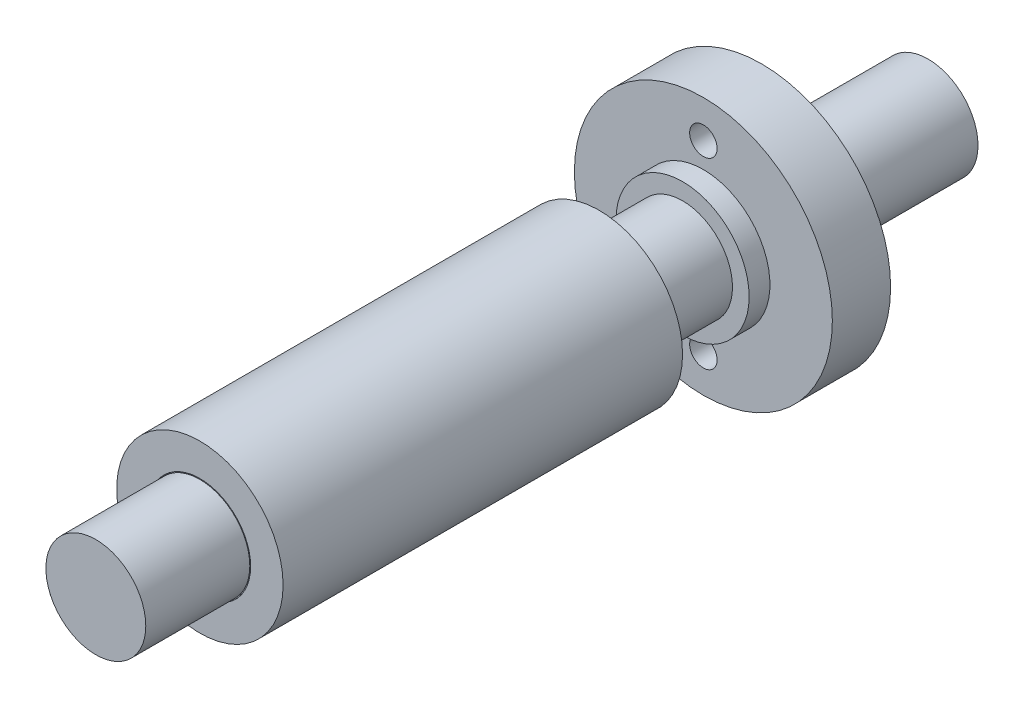
ISO-10303-21;
HEADER;
FILE_DESCRIPTION(('STEP AP214'),'2;1');
FILE_NAME('part.step','',(''),(''),'','','');
FILE_SCHEMA(('AUTOMOTIVE_DESIGN { 1 0 10303 214 1 1 1 1 }'));
ENDSEC;
DATA;
#1=APPLICATION_CONTEXT('core data for automotive mechanical design processes');
#2=APPLICATION_PROTOCOL_DEFINITION('international standard','automotive_design',2000,#1);
#3=PRODUCT_CONTEXT('',#1,'mechanical');
#4=PRODUCT('Part','Part','',(#3));
#5=PRODUCT_RELATED_PRODUCT_CATEGORY('part','',(#4));
#6=PRODUCT_DEFINITION_FORMATION('','',#4);
#7=PRODUCT_DEFINITION_CONTEXT('part definition',#1,'design');
#8=PRODUCT_DEFINITION('design','',#6,#7);
#9=PRODUCT_DEFINITION_SHAPE('','',#8);
#10=(LENGTH_UNIT() NAMED_UNIT(*) SI_UNIT(.MILLI.,.METRE.));
#11=(NAMED_UNIT(*) PLANE_ANGLE_UNIT() SI_UNIT($,.RADIAN.));
#12=(NAMED_UNIT(*) SI_UNIT($,.STERADIAN.) SOLID_ANGLE_UNIT());
#13=UNCERTAINTY_MEASURE_WITH_UNIT(LENGTH_MEASURE(1.E-05),#10,'distance_accuracy_value','');
#14=(GEOMETRIC_REPRESENTATION_CONTEXT(3) GLOBAL_UNCERTAINTY_ASSIGNED_CONTEXT((#13)) GLOBAL_UNIT_ASSIGNED_CONTEXT((#10,
#11,#12)) REPRESENTATION_CONTEXT('',''));
#15=CARTESIAN_POINT('',(0.,0.,0.));
#16=DIRECTION('',(0.,0.,1.));
#17=DIRECTION('',(1.,0.,0.));
#18=AXIS2_PLACEMENT_3D('',#15,#16,#17);
#19=CARTESIAN_POINT('',(0.,0.,22.2465945390482));
#20=DIRECTION('',(0.,0.,1.));
#21=DIRECTION('',(1.,0.,0.));
#22=AXIS2_PLACEMENT_3D('',#19,#20,#21);
#23=CYLINDRICAL_SURFACE('',#22,6.1);
#24=CARTESIAN_POINT('',(0.,0.,39.5));
#25=DIRECTION('',(0.,0.,1.));
#26=DIRECTION('',(1.,0.,0.));
#27=AXIS2_PLACEMENT_3D('',#24,#25,#26);
#28=CIRCLE('',#27,6.1);
#29=CARTESIAN_POINT('',(6.1,0.,39.5));
#30=VERTEX_POINT('',#29);
#31=EDGE_CURVE('E61',#30,#30,#28,.F.);
#32=ORIENTED_EDGE('',*,*,#31,.T.);
#33=EDGE_LOOP('',(#32));
#34=FACE_BOUND('',#33,.T.);
#35=CARTESIAN_POINT('',(0.,0.,87.5));
#36=DIRECTION('',(0.,0.,1.));
#37=DIRECTION('',(1.,0.,0.));
#38=AXIS2_PLACEMENT_3D('',#35,#36,#37);
#39=CIRCLE('',#38,6.1);
#40=CARTESIAN_POINT('',(6.1,0.,87.5));
#41=VERTEX_POINT('',#40);
#42=EDGE_CURVE('E70',#41,#41,#39,.T.);
#43=ORIENTED_EDGE('',*,*,#42,.T.);
#44=EDGE_LOOP('',(#43));
#45=FACE_BOUND('',#44,.T.);
#46=ADVANCED_FACE('F58',(#34,#45),#23,.F.);
#47=CARTESIAN_POINT('',(0.,0.,87.5));
#48=DIRECTION('',(0.,0.,1.));
#49=DIRECTION('',(1.,0.,0.));
#50=AXIS2_PLACEMENT_3D('',#47,#48,#49);
#51=PLANE('',#50);
#52=ORIENTED_EDGE('',*,*,#42,.F.);
#53=EDGE_LOOP('',(#52));
#54=FACE_BOUND('',#53,.T.);
#55=CARTESIAN_POINT('',(0.,0.,87.5));
#56=DIRECTION('',(0.,0.,1.));
#57=DIRECTION('',(1.,0.,0.));
#58=AXIS2_PLACEMENT_3D('',#55,#56,#57);
#59=CIRCLE('',#58,10.);
#60=CARTESIAN_POINT('',(10.,0.,87.5));
#61=VERTEX_POINT('',#60);
#62=EDGE_CURVE('E65',#61,#61,#59,.T.);
#63=ORIENTED_EDGE('',*,*,#62,.T.);
#64=EDGE_LOOP('',(#63));
#65=FACE_BOUND('',#64,.T.);
#66=ADVANCED_FACE('F87',(#54,#65),#51,.T.);
#67=CARTESIAN_POINT('',(0.,0.,87.5));
#68=DIRECTION('',(0.,0.,-1.));
#69=DIRECTION('',(-1.,0.,0.));
#70=AXIS2_PLACEMENT_3D('',#67,#68,#69);
#71=CYLINDRICAL_SURFACE('',#70,10.);
#72=ORIENTED_EDGE('',*,*,#62,.F.);
#73=EDGE_LOOP('',(#72));
#74=FACE_BOUND('',#73,.T.);
#75=CARTESIAN_POINT('',(0.,0.,39.5));
#76=DIRECTION('',(0.,0.,1.));
#77=DIRECTION('',(1.,0.,0.));
#78=AXIS2_PLACEMENT_3D('',#75,#76,#77);
#79=CIRCLE('',#78,10.);
#80=CARTESIAN_POINT('',(10.,0.,39.5));
#81=VERTEX_POINT('',#80);
#82=EDGE_CURVE('E11',#81,#81,#79,.T.);
#83=ORIENTED_EDGE('',*,*,#82,.T.);
#84=EDGE_LOOP('',(#83));
#85=FACE_BOUND('',#84,.T.);
#86=ADVANCED_FACE('F82',(#74,#85),#71,.T.);
#87=CARTESIAN_POINT('',(0.,0.,39.5));
#88=DIRECTION('',(0.,0.,1.));
#89=DIRECTION('',(1.,0.,0.));
#90=AXIS2_PLACEMENT_3D('',#87,#88,#89);
#91=PLANE('',#90);
#92=ORIENTED_EDGE('',*,*,#31,.F.);
#93=EDGE_LOOP('',(#92));
#94=FACE_BOUND('',#93,.T.);
#95=ORIENTED_EDGE('',*,*,#82,.F.);
#96=EDGE_LOOP('',(#95));
#97=FACE_BOUND('',#96,.T.);
#98=ADVANCED_FACE('F79',(#94,#97),#91,.F.);
#99=CLOSED_SHELL('',(#46,#66,#86,#98));
#100=MANIFOLD_SOLID_BREP('B2_NOT_SHOWN',#99);
#101=CARTESIAN_POINT('',(0.,0.,100.));
#102=DIRECTION('',(0.,0.,-1.));
#103=DIRECTION('',(-1.,0.,0.));
#104=AXIS2_PLACEMENT_3D('',#101,#102,#103);
#105=CYLINDRICAL_SURFACE('',#104,6.);
#106=CARTESIAN_POINT('',(0.,0.,40.5));
#107=DIRECTION('',(0.,0.,1.));
#108=DIRECTION('',(1.,0.,0.));
#109=AXIS2_PLACEMENT_3D('',#106,#107,#108);
#110=CIRCLE('',#109,6.);
#111=CARTESIAN_POINT('',(6.,0.,40.5));
#112=VERTEX_POINT('',#111);
#113=EDGE_CURVE('E183',#112,#112,#110,.T.);
#114=ORIENTED_EDGE('',*,*,#113,.T.);
#115=EDGE_LOOP('',(#114));
#116=FACE_BOUND('',#115,.T.);
#117=CARTESIAN_POINT('',(0.,0.,86.5));
#118=DIRECTION('',(0.,0.,1.));
#119=DIRECTION('',(1.,0.,0.));
#120=AXIS2_PLACEMENT_3D('',#117,#118,#119);
#121=CIRCLE('',#120,6.);
#122=CARTESIAN_POINT('',(6.,0.,86.5));
#123=VERTEX_POINT('',#122);
#124=EDGE_CURVE('E261',#123,#123,#121,.T.);
#125=ORIENTED_EDGE('',*,*,#124,.F.);
#126=EDGE_LOOP('',(#125));
#127=FACE_BOUND('',#126,.T.);
#128=ADVANCED_FACE('F141',(#116,#127),#105,.T.);
#129=CARTESIAN_POINT('',(0.,0.,29.5));
#130=DIRECTION('',(0.,0.,1.));
#131=DIRECTION('',(1.,0.,0.));
#132=AXIS2_PLACEMENT_3D('',#129,#130,#131);
#133=CIRCLE('',#132,6.);
#134=CARTESIAN_POINT('',(6.,0.,29.5));
#135=VERTEX_POINT('',#134);
#136=EDGE_CURVE('E162',#135,#135,#133,.T.);
#137=ORIENTED_EDGE('',*,*,#136,.T.);
#138=EDGE_LOOP('',(#137));
#139=FACE_BOUND('',#138,.T.);
#140=CARTESIAN_POINT('',(0.,0.,39.5));
#141=DIRECTION('',(0.,0.,1.));
#142=DIRECTION('',(1.,0.,0.));
#143=AXIS2_PLACEMENT_3D('',#140,#141,#142);
#144=CIRCLE('',#143,6.);
#145=CARTESIAN_POINT('',(6.,0.,39.5));
#146=VERTEX_POINT('',#145);
#147=EDGE_CURVE('E186',#146,#146,#144,.T.);
#148=ORIENTED_EDGE('',*,*,#147,.F.);
#149=EDGE_LOOP('',(#148));
#150=FACE_BOUND('',#149,.T.);
#151=ADVANCED_FACE('F218',(#139,#150),#105,.T.);
#152=CARTESIAN_POINT('',(0.,0.,27.));
#153=DIRECTION('',(0.,0.,-1.));
#154=DIRECTION('',(-1.,0.,0.));
#155=AXIS2_PLACEMENT_3D('',#152,#153,#154);
#156=CYLINDRICAL_SURFACE('',#155,15.5);
#157=CARTESIAN_POINT('',(0.,0.,27.));
#158=DIRECTION('',(0.,0.,-1.));
#159=DIRECTION('',(-1.,0.,0.));
#160=AXIS2_PLACEMENT_3D('',#157,#158,#159);
#161=CIRCLE('',#160,15.5);
#162=CARTESIAN_POINT('',(-15.5,0.,27.));
#163=VERTEX_POINT('',#162);
#164=EDGE_CURVE('E192',#163,#163,#161,.T.);
#165=ORIENTED_EDGE('',*,*,#164,.T.);
#166=EDGE_LOOP('',(#165));
#167=FACE_BOUND('',#166,.T.);
#168=CARTESIAN_POINT('',(0.,0.,20.));
#169=DIRECTION('',(0.,0.,-1.));
#170=DIRECTION('',(-1.,0.,0.));
#171=AXIS2_PLACEMENT_3D('',#168,#169,#170);
#172=CIRCLE('',#171,15.5);
#173=CARTESIAN_POINT('',(-15.5,0.,20.));
#174=VERTEX_POINT('',#173);
#175=EDGE_CURVE('E165',#174,#174,#172,.T.);
#176=ORIENTED_EDGE('',*,*,#175,.F.);
#177=EDGE_LOOP('',(#176));
#178=FACE_BOUND('',#177,.T.);
#179=ADVANCED_FACE('F216',(#167,#178),#156,.T.);
#180=CARTESIAN_POINT('',(0.,0.,27.));
#181=DIRECTION('',(0.,0.,-1.));
#182=DIRECTION('',(-1.,0.,0.));
#183=AXIS2_PLACEMENT_3D('',#180,#181,#182);
#184=PLANE('',#183);
#185=CARTESIAN_POINT('',(0.,11.,27.));
#186=DIRECTION('',(0.,0.,1.));
#187=DIRECTION('',(1.,0.,0.));
#188=AXIS2_PLACEMENT_3D('',#185,#186,#187);
#189=CIRCLE('',#188,1.65);
#190=CARTESIAN_POINT('',(1.65,11.,27.));
#191=VERTEX_POINT('',#190);
#192=EDGE_CURVE('E170',#191,#191,#189,.T.);
#193=ORIENTED_EDGE('',*,*,#192,.F.);
#194=EDGE_LOOP('',(#193));
#195=FACE_BOUND('',#194,.T.);
#196=CARTESIAN_POINT('',(0.,-11.,27.));
#197=DIRECTION('',(0.,0.,1.));
#198=DIRECTION('',(1.,0.,0.));
#199=AXIS2_PLACEMENT_3D('',#196,#197,#198);
#200=CIRCLE('',#199,1.65);
#201=CARTESIAN_POINT('',(1.65,-11.,27.));
#202=VERTEX_POINT('',#201);
#203=EDGE_CURVE('E177',#202,#202,#200,.T.);
#204=ORIENTED_EDGE('',*,*,#203,.F.);
#205=EDGE_LOOP('',(#204));
#206=FACE_BOUND('',#205,.T.);
#207=CARTESIAN_POINT('',(0.,0.,27.));
#208=DIRECTION('',(0.,0.,-1.));
#209=DIRECTION('',(-1.,0.,0.));
#210=AXIS2_PLACEMENT_3D('',#207,#208,#209);
#211=CIRCLE('',#210,8.);
#212=CARTESIAN_POINT('',(-8.,0.,27.));
#213=VERTEX_POINT('',#212);
#214=EDGE_CURVE('E57',#213,#213,#211,.F.);
#215=ORIENTED_EDGE('',*,*,#214,.F.);
#216=EDGE_LOOP('',(#215));
#217=FACE_BOUND('',#216,.T.);
#218=ORIENTED_EDGE('',*,*,#164,.F.);
#219=EDGE_LOOP('',(#218));
#220=FACE_BOUND('',#219,.T.);
#221=ADVANCED_FACE('F211',(#195,#206,#217,#220),#184,.F.);
#222=CARTESIAN_POINT('',(0.,0.,20.));
#223=DIRECTION('',(0.,0.,-1.));
#224=DIRECTION('',(-1.,0.,0.));
#225=AXIS2_PLACEMENT_3D('',#222,#223,#224);
#226=PLANE('',#225);
#227=CARTESIAN_POINT('',(0.,11.,20.));
#228=DIRECTION('',(0.,0.,-1.));
#229=DIRECTION('',(-1.,0.,0.));
#230=AXIS2_PLACEMENT_3D('',#227,#228,#229);
#231=CIRCLE('',#230,1.65);
#232=CARTESIAN_POINT('',(-1.65,11.,20.));
#233=VERTEX_POINT('',#232);
#234=EDGE_CURVE('E145',#233,#233,#231,.T.);
#235=ORIENTED_EDGE('',*,*,#234,.F.);
#236=EDGE_LOOP('',(#235));
#237=FACE_BOUND('',#236,.T.);
#238=CARTESIAN_POINT('',(0.,-11.,20.));
#239=DIRECTION('',(0.,0.,-1.));
#240=DIRECTION('',(-1.,0.,0.));
#241=AXIS2_PLACEMENT_3D('',#238,#239,#240);
#242=CIRCLE('',#241,1.65);
#243=CARTESIAN_POINT('',(-1.65,-11.,20.));
#244=VERTEX_POINT('',#243);
#245=EDGE_CURVE('E167',#244,#244,#242,.T.);
#246=ORIENTED_EDGE('',*,*,#245,.F.);
#247=EDGE_LOOP('',(#246));
#248=FACE_BOUND('',#247,.T.);
#249=CARTESIAN_POINT('',(0.,0.,20.));
#250=DIRECTION('',(0.,0.,-1.));
#251=DIRECTION('',(-1.,0.,0.));
#252=AXIS2_PLACEMENT_3D('',#249,#250,#251);
#253=CIRCLE('',#252,6.);
#254=CARTESIAN_POINT('',(-6.,0.,20.));
#255=VERTEX_POINT('',#254);
#256=EDGE_CURVE('E160',#255,#255,#253,.T.);
#257=ORIENTED_EDGE('',*,*,#256,.F.);
#258=EDGE_LOOP('',(#257));
#259=FACE_BOUND('',#258,.T.);
#260=ORIENTED_EDGE('',*,*,#175,.T.);
#261=EDGE_LOOP('',(#260));
#262=FACE_BOUND('',#261,.T.);
#263=ADVANCED_FACE('F207',(#237,#248,#259,#262),#226,.T.);
#264=CARTESIAN_POINT('',(0.,0.,0.));
#265=DIRECTION('',(0.,0.,1.));
#266=DIRECTION('',(1.,0.,0.));
#267=AXIS2_PLACEMENT_3D('',#264,#265,#266);
#268=PLANE('',#267);
#269=CARTESIAN_POINT('',(0.,0.,0.));
#270=DIRECTION('',(0.,0.,1.));
#271=DIRECTION('',(1.,0.,0.));
#272=AXIS2_PLACEMENT_3D('',#269,#270,#271);
#273=CIRCLE('',#272,6.);
#274=CARTESIAN_POINT('',(6.,0.,0.));
#275=VERTEX_POINT('',#274);
#276=EDGE_CURVE('E156',#275,#275,#273,.T.);
#277=ORIENTED_EDGE('',*,*,#276,.F.);
#278=EDGE_LOOP('',(#277));
#279=FACE_BOUND('',#278,.T.);
#280=ADVANCED_FACE('F210',(#279),#268,.F.);
#281=ORIENTED_EDGE('',*,*,#256,.T.);
#282=EDGE_LOOP('',(#281));
#283=FACE_BOUND('',#282,.T.);
#284=ORIENTED_EDGE('',*,*,#276,.T.);
#285=EDGE_LOOP('',(#284));
#286=FACE_BOUND('',#285,.T.);
#287=ADVANCED_FACE('F143',(#283,#286),#105,.T.);
#288=CARTESIAN_POINT('',(0.,0.,29.5));
#289=DIRECTION('',(0.,0.,-1.));
#290=DIRECTION('',(-1.,0.,0.));
#291=AXIS2_PLACEMENT_3D('',#288,#289,#290);
#292=CYLINDRICAL_SURFACE('',#291,8.);
#293=CARTESIAN_POINT('',(0.,0.,29.5));
#294=DIRECTION('',(0.,0.,1.));
#295=DIRECTION('',(1.,0.,0.));
#296=AXIS2_PLACEMENT_3D('',#293,#294,#295);
#297=CIRCLE('',#296,8.);
#298=CARTESIAN_POINT('',(8.,0.,29.5));
#299=VERTEX_POINT('',#298);
#300=EDGE_CURVE('E166',#299,#299,#297,.T.);
#301=ORIENTED_EDGE('',*,*,#300,.F.);
#302=EDGE_LOOP('',(#301));
#303=FACE_BOUND('',#302,.T.);
#304=ORIENTED_EDGE('',*,*,#214,.T.);
#305=EDGE_LOOP('',(#304));
#306=FACE_BOUND('',#305,.T.);
#307=ADVANCED_FACE('F237',(#303,#306),#292,.T.);
#308=CARTESIAN_POINT('',(0.,0.,29.5));
#309=DIRECTION('',(0.,0.,1.));
#310=DIRECTION('',(1.,0.,0.));
#311=AXIS2_PLACEMENT_3D('',#308,#309,#310);
#312=PLANE('',#311);
#313=ORIENTED_EDGE('',*,*,#136,.F.);
#314=EDGE_LOOP('',(#313));
#315=FACE_BOUND('',#314,.T.);
#316=ORIENTED_EDGE('',*,*,#300,.T.);
#317=EDGE_LOOP('',(#316));
#318=FACE_BOUND('',#317,.T.);
#319=ADVANCED_FACE('F242',(#315,#318),#312,.T.);
#320=CARTESIAN_POINT('',(0.,-11.,-21.));
#321=DIRECTION('',(0.,0.,1.));
#322=DIRECTION('',(1.,0.,0.));
#323=AXIS2_PLACEMENT_3D('',#320,#321,#322);
#324=CYLINDRICAL_SURFACE('',#323,1.65);
#325=ORIENTED_EDGE('',*,*,#245,.T.);
#326=EDGE_LOOP('',(#325));
#327=FACE_BOUND('',#326,.T.);
#328=ORIENTED_EDGE('',*,*,#203,.T.);
#329=EDGE_LOOP('',(#328));
#330=FACE_BOUND('',#329,.T.);
#331=ADVANCED_FACE('F312',(#327,#330),#324,.F.);
#332=CARTESIAN_POINT('',(0.,11.,-21.));
#333=DIRECTION('',(0.,0.,1.));
#334=DIRECTION('',(1.,0.,0.));
#335=AXIS2_PLACEMENT_3D('',#332,#333,#334);
#336=CYLINDRICAL_SURFACE('',#335,1.65);
#337=ORIENTED_EDGE('',*,*,#234,.T.);
#338=EDGE_LOOP('',(#337));
#339=FACE_BOUND('',#338,.T.);
#340=ORIENTED_EDGE('',*,*,#192,.T.);
#341=EDGE_LOOP('',(#340));
#342=FACE_BOUND('',#341,.T.);
#343=ADVANCED_FACE('F308',(#339,#342),#336,.F.);
#344=CARTESIAN_POINT('',(0.,0.,40.5));
#345=DIRECTION('',(0.,0.,-1.));
#346=DIRECTION('',(-1.,0.,0.));
#347=AXIS2_PLACEMENT_3D('',#344,#345,#346);
#348=CYLINDRICAL_SURFACE('',#347,5.25);
#349=CARTESIAN_POINT('',(0.,0.,40.5));
#350=DIRECTION('',(0.,0.,1.));
#351=DIRECTION('',(1.,0.,0.));
#352=AXIS2_PLACEMENT_3D('',#349,#350,#351);
#353=CIRCLE('',#352,5.25);
#354=CARTESIAN_POINT('',(5.25,0.,40.5));
#355=VERTEX_POINT('',#354);
#356=EDGE_CURVE('E274',#355,#355,#353,.T.);
#357=ORIENTED_EDGE('',*,*,#356,.F.);
#358=EDGE_LOOP('',(#357));
#359=FACE_BOUND('',#358,.T.);
#360=CARTESIAN_POINT('',(0.,0.,39.5));
#361=DIRECTION('',(0.,0.,1.));
#362=DIRECTION('',(1.,0.,0.));
#363=AXIS2_PLACEMENT_3D('',#360,#361,#362);
#364=CIRCLE('',#363,5.25);
#365=CARTESIAN_POINT('',(5.25,0.,39.5));
#366=VERTEX_POINT('',#365);
#367=EDGE_CURVE('E267',#366,#366,#364,.T.);
#368=ORIENTED_EDGE('',*,*,#367,.T.);
#369=EDGE_LOOP('',(#368));
#370=FACE_BOUND('',#369,.T.);
#371=ADVANCED_FACE('F301',(#359,#370),#348,.T.);
#372=CARTESIAN_POINT('',(0.,0.,40.5));
#373=DIRECTION('',(0.,0.,1.));
#374=DIRECTION('',(1.,0.,0.));
#375=AXIS2_PLACEMENT_3D('',#372,#373,#374);
#376=PLANE('',#375);
#377=ORIENTED_EDGE('',*,*,#356,.T.);
#378=EDGE_LOOP('',(#377));
#379=FACE_BOUND('',#378,.T.);
#380=ORIENTED_EDGE('',*,*,#113,.F.);
#381=EDGE_LOOP('',(#380));
#382=FACE_BOUND('',#381,.T.);
#383=ADVANCED_FACE('F291',(#379,#382),#376,.F.);
#384=CARTESIAN_POINT('',(0.,0.,39.5));
#385=DIRECTION('',(0.,0.,1.));
#386=DIRECTION('',(1.,0.,0.));
#387=AXIS2_PLACEMENT_3D('',#384,#385,#386);
#388=PLANE('',#387);
#389=ORIENTED_EDGE('',*,*,#367,.F.);
#390=EDGE_LOOP('',(#389));
#391=FACE_BOUND('',#390,.T.);
#392=ORIENTED_EDGE('',*,*,#147,.T.);
#393=EDGE_LOOP('',(#392));
#394=FACE_BOUND('',#393,.T.);
#395=ADVANCED_FACE('F287',(#391,#394),#388,.T.);
#396=CARTESIAN_POINT('',(0.,0.,86.5));
#397=DIRECTION('',(0.,0.,1.));
#398=DIRECTION('',(1.,0.,0.));
#399=AXIS2_PLACEMENT_3D('',#396,#397,#398);
#400=PLANE('',#399);
#401=CARTESIAN_POINT('',(0.,0.,86.5));
#402=DIRECTION('',(0.,0.,1.));
#403=DIRECTION('',(1.,0.,0.));
#404=AXIS2_PLACEMENT_3D('',#401,#402,#403);
#405=CIRCLE('',#404,5.25);
#406=CARTESIAN_POINT('',(5.25,0.,86.5));
#407=VERTEX_POINT('',#406);
#408=EDGE_CURVE('E262',#407,#407,#405,.T.);
#409=ORIENTED_EDGE('',*,*,#408,.F.);
#410=EDGE_LOOP('',(#409));
#411=FACE_BOUND('',#410,.T.);
#412=ORIENTED_EDGE('',*,*,#124,.T.);
#413=EDGE_LOOP('',(#412));
#414=FACE_BOUND('',#413,.T.);
#415=ADVANCED_FACE('F290',(#411,#414),#400,.T.);
#416=CARTESIAN_POINT('',(0.,0.,87.5));
#417=DIRECTION('',(0.,0.,1.));
#418=DIRECTION('',(1.,0.,0.));
#419=AXIS2_PLACEMENT_3D('',#416,#417,#418);
#420=PLANE('',#419);
#421=CARTESIAN_POINT('',(0.,0.,87.5));
#422=DIRECTION('',(0.,0.,1.));
#423=DIRECTION('',(1.,0.,0.));
#424=AXIS2_PLACEMENT_3D('',#421,#422,#423);
#425=CIRCLE('',#424,5.25);
#426=CARTESIAN_POINT('',(5.25,0.,87.5));
#427=VERTEX_POINT('',#426);
#428=EDGE_CURVE('E270',#427,#427,#425,.T.);
#429=ORIENTED_EDGE('',*,*,#428,.T.);
#430=EDGE_LOOP('',(#429));
#431=FACE_BOUND('',#430,.T.);
#432=CARTESIAN_POINT('',(0.,0.,87.5));
#433=DIRECTION('',(0.,0.,1.));
#434=DIRECTION('',(1.,0.,0.));
#435=AXIS2_PLACEMENT_3D('',#432,#433,#434);
#436=CIRCLE('',#435,6.);
#437=CARTESIAN_POINT('',(6.,0.,87.5));
#438=VERTEX_POINT('',#437);
#439=EDGE_CURVE('E257',#438,#438,#436,.T.);
#440=ORIENTED_EDGE('',*,*,#439,.F.);
#441=EDGE_LOOP('',(#440));
#442=FACE_BOUND('',#441,.T.);
#443=ADVANCED_FACE('F298',(#431,#442),#420,.F.);
#444=CARTESIAN_POINT('',(0.,0.,86.5));
#445=DIRECTION('',(0.,0.,1.));
#446=DIRECTION('',(1.,0.,0.));
#447=AXIS2_PLACEMENT_3D('',#444,#445,#446);
#448=CYLINDRICAL_SURFACE('',#447,5.25);
#449=ORIENTED_EDGE('',*,*,#408,.T.);
#450=EDGE_LOOP('',(#449));
#451=FACE_BOUND('',#450,.T.);
#452=ORIENTED_EDGE('',*,*,#428,.F.);
#453=EDGE_LOOP('',(#452));
#454=FACE_BOUND('',#453,.T.);
#455=ADVANCED_FACE('F252',(#451,#454),#448,.T.);
#456=CARTESIAN_POINT('',(0.,0.,100.));
#457=DIRECTION('',(0.,0.,1.));
#458=DIRECTION('',(1.,0.,0.));
#459=AXIS2_PLACEMENT_3D('',#456,#457,#458);
#460=PLANE('',#459);
#461=CARTESIAN_POINT('',(0.,0.,100.));
#462=DIRECTION('',(0.,0.,1.));
#463=DIRECTION('',(1.,0.,0.));
#464=AXIS2_PLACEMENT_3D('',#461,#462,#463);
#465=CIRCLE('',#464,6.);
#466=CARTESIAN_POINT('',(6.,0.,100.));
#467=VERTEX_POINT('',#466);
#468=EDGE_CURVE('E150',#467,#467,#465,.T.);
#469=ORIENTED_EDGE('',*,*,#468,.T.);
#470=EDGE_LOOP('',(#469));
#471=FACE_BOUND('',#470,.T.);
#472=ADVANCED_FACE('F247',(#471),#460,.T.);
#473=ORIENTED_EDGE('',*,*,#439,.T.);
#474=EDGE_LOOP('',(#473));
#475=FACE_BOUND('',#474,.T.);
#476=ORIENTED_EDGE('',*,*,#468,.F.);
#477=EDGE_LOOP('',(#476));
#478=FACE_BOUND('',#477,.T.);
#479=ADVANCED_FACE('F228',(#475,#478),#105,.T.);
#480=CLOSED_SHELL('',(#128,#151,#179,#221,#263,#280,#287,#307,#319,#331,#343,#371,#383,#395,
#415,#443,#455,#472,#479));
#481=MANIFOLD_SOLID_BREP('B6',#480);
#482=ADVANCED_BREP_SHAPE_REPRESENTATION('',(#18,#100,#481),#14);
#483=SHAPE_DEFINITION_REPRESENTATION(#9,#482);
ENDSEC;
END-ISO-10303-21;
